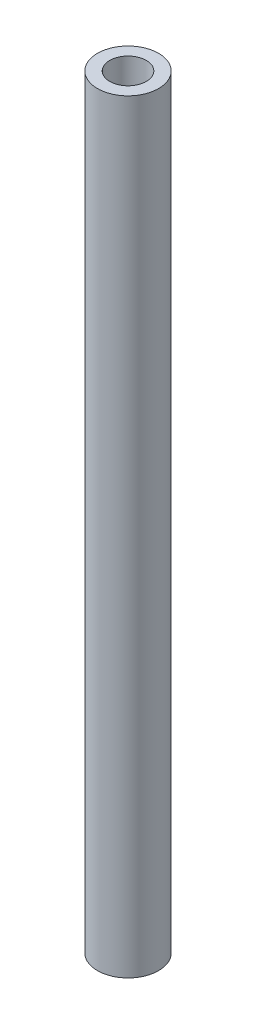
ISO-10303-21;
HEADER;
FILE_DESCRIPTION(('STEP AP214'),'2;1');
FILE_NAME('part.step','',(''),(''),'','','');
FILE_SCHEMA(('AUTOMOTIVE_DESIGN { 1 0 10303 214 1 1 1 1 }'));
ENDSEC;
DATA;
#1=APPLICATION_CONTEXT('core data for automotive mechanical design processes');
#2=APPLICATION_PROTOCOL_DEFINITION('international standard','automotive_design',2000,#1);
#3=PRODUCT_CONTEXT('',#1,'mechanical');
#4=PRODUCT('Part','Part','',(#3));
#5=PRODUCT_RELATED_PRODUCT_CATEGORY('part','',(#4));
#6=PRODUCT_DEFINITION_FORMATION('','',#4);
#7=PRODUCT_DEFINITION_CONTEXT('part definition',#1,'design');
#8=PRODUCT_DEFINITION('design','',#6,#7);
#9=PRODUCT_DEFINITION_SHAPE('','',#8);
#10=(LENGTH_UNIT() NAMED_UNIT(*) SI_UNIT(.MILLI.,.METRE.));
#11=(NAMED_UNIT(*) PLANE_ANGLE_UNIT() SI_UNIT($,.RADIAN.));
#12=(NAMED_UNIT(*) SI_UNIT($,.STERADIAN.) SOLID_ANGLE_UNIT());
#13=UNCERTAINTY_MEASURE_WITH_UNIT(LENGTH_MEASURE(1.E-05),#10,'distance_accuracy_value','');
#14=(GEOMETRIC_REPRESENTATION_CONTEXT(3) GLOBAL_UNCERTAINTY_ASSIGNED_CONTEXT((#13)) GLOBAL_UNIT_ASSIGNED_CONTEXT((#10,
#11,#12)) REPRESENTATION_CONTEXT('',''));
#15=CARTESIAN_POINT('',(0.,0.,0.));
#16=DIRECTION('',(0.,0.,1.));
#17=DIRECTION('',(1.,0.,0.));
#18=AXIS2_PLACEMENT_3D('',#15,#16,#17);
#19=CARTESIAN_POINT('',(0.,79.375,0.));
#20=DIRECTION('',(0.,-1.,0.));
#21=DIRECTION('',(0.,0.,-1.));
#22=AXIS2_PLACEMENT_3D('',#19,#20,#21);
#23=CYLINDRICAL_SURFACE('',#22,3.175);
#24=CARTESIAN_POINT('',(0.,79.375,0.));
#25=DIRECTION('',(0.,1.,0.));
#26=DIRECTION('',(0.,0.,1.));
#27=AXIS2_PLACEMENT_3D('',#24,#25,#26);
#28=CIRCLE('',#27,3.175);
#29=CARTESIAN_POINT('',(0.,79.375,-3.175));
#30=VERTEX_POINT('',#29);
#31=EDGE_CURVE('E11',#30,#30,#28,.T.);
#32=CARTESIAN_POINT('',(0.,0.,0.));
#33=DIRECTION('',(0.,1.,0.));
#34=DIRECTION('',(0.,0.,1.));
#35=AXIS2_PLACEMENT_3D('',#32,#33,#34);
#36=CIRCLE('',#35,3.175);
#37=CARTESIAN_POINT('',(0.,0.,-3.175));
#38=VERTEX_POINT('',#37);
#39=EDGE_CURVE('E46',#38,#38,#36,.T.);
#40=CARTESIAN_POINT('',(0.,79.375,-3.175));
#41=CARTESIAN_POINT('',(0.,78.5481770833333,-3.175));
#42=CARTESIAN_POINT('',(0.,77.7213541666667,-3.175));
#43=CARTESIAN_POINT('',(0.,76.0677083333333,-3.175));
#44=CARTESIAN_POINT('',(0.,75.2408854166667,-3.175));
#45=CARTESIAN_POINT('',(0.,73.5872395833333,-3.175));
#46=CARTESIAN_POINT('',(0.,72.7604166666667,-3.175));
#47=CARTESIAN_POINT('',(0.,71.1067708333333,-3.175));
#48=CARTESIAN_POINT('',(0.,70.2799479166667,-3.175));
#49=CARTESIAN_POINT('',(0.,68.6263020833333,-3.175));
#50=CARTESIAN_POINT('',(0.,67.7994791666667,-3.175));
#51=CARTESIAN_POINT('',(0.,66.1458333333333,-3.175));
#52=CARTESIAN_POINT('',(0.,65.3190104166667,-3.175));
#53=CARTESIAN_POINT('',(0.,63.6653645833333,-3.175));
#54=CARTESIAN_POINT('',(0.,62.8385416666667,-3.175));
#55=CARTESIAN_POINT('',(0.,61.1848958333333,-3.175));
#56=CARTESIAN_POINT('',(0.,60.3580729166667,-3.175));
#57=CARTESIAN_POINT('',(0.,58.7044270833333,-3.175));
#58=CARTESIAN_POINT('',(0.,57.8776041666667,-3.175));
#59=CARTESIAN_POINT('',(0.,56.2239583333333,-3.175));
#60=CARTESIAN_POINT('',(0.,55.3971354166667,-3.175));
#61=CARTESIAN_POINT('',(0.,53.7434895833333,-3.175));
#62=CARTESIAN_POINT('',(0.,52.9166666666667,-3.175));
#63=CARTESIAN_POINT('',(0.,51.2630208333333,-3.175));
#64=CARTESIAN_POINT('',(0.,50.4361979166667,-3.175));
#65=CARTESIAN_POINT('',(0.,48.7825520833333,-3.175));
#66=CARTESIAN_POINT('',(0.,47.9557291666667,-3.175));
#67=CARTESIAN_POINT('',(0.,46.3020833333333,-3.175));
#68=CARTESIAN_POINT('',(0.,45.4752604166667,-3.175));
#69=CARTESIAN_POINT('',(0.,43.8216145833333,-3.175));
#70=CARTESIAN_POINT('',(0.,42.9947916666667,-3.175));
#71=CARTESIAN_POINT('',(0.,41.3411458333333,-3.175));
#72=CARTESIAN_POINT('',(0.,40.5143229166667,-3.175));
#73=CARTESIAN_POINT('',(0.,38.8606770833333,-3.175));
#74=CARTESIAN_POINT('',(0.,38.0338541666667,-3.175));
#75=CARTESIAN_POINT('',(0.,36.3802083333333,-3.175));
#76=CARTESIAN_POINT('',(0.,35.5533854166667,-3.175));
#77=CARTESIAN_POINT('',(0.,33.8997395833333,-3.175));
#78=CARTESIAN_POINT('',(0.,33.0729166666667,-3.175));
#79=CARTESIAN_POINT('',(0.,31.4192708333333,-3.175));
#80=CARTESIAN_POINT('',(0.,30.5924479166667,-3.175));
#81=CARTESIAN_POINT('',(0.,28.9388020833333,-3.175));
#82=CARTESIAN_POINT('',(0.,28.1119791666667,-3.175));
#83=CARTESIAN_POINT('',(0.,26.4583333333333,-3.175));
#84=CARTESIAN_POINT('',(0.,25.6315104166667,-3.175));
#85=CARTESIAN_POINT('',(0.,23.9778645833333,-3.175));
#86=CARTESIAN_POINT('',(0.,23.1510416666667,-3.175));
#87=CARTESIAN_POINT('',(0.,21.4973958333333,-3.175));
#88=CARTESIAN_POINT('',(0.,20.6705729166667,-3.175));
#89=CARTESIAN_POINT('',(0.,19.0169270833333,-3.175));
#90=CARTESIAN_POINT('',(0.,18.1901041666667,-3.175));
#91=CARTESIAN_POINT('',(0.,16.5364583333333,-3.175));
#92=CARTESIAN_POINT('',(0.,15.7096354166667,-3.175));
#93=CARTESIAN_POINT('',(0.,14.0559895833333,-3.175));
#94=CARTESIAN_POINT('',(0.,13.2291666666667,-3.175));
#95=CARTESIAN_POINT('',(0.,11.5755208333333,-3.175));
#96=CARTESIAN_POINT('',(0.,10.7486979166667,-3.175));
#97=CARTESIAN_POINT('',(0.,9.09505208333332,-3.175));
#98=CARTESIAN_POINT('',(0.,8.26822916666666,-3.175));
#99=CARTESIAN_POINT('',(0.,6.61458333333332,-3.175));
#100=CARTESIAN_POINT('',(0.,5.78776041666665,-3.175));
#101=CARTESIAN_POINT('',(0.,4.13411458333332,-3.175));
#102=CARTESIAN_POINT('',(0.,3.30729166666666,-3.175));
#103=CARTESIAN_POINT('',(0.,1.65364583333332,-3.175));
#104=CARTESIAN_POINT('',(0.,0.826822916666655,-3.175));
#105=CARTESIAN_POINT('',(0.,0.,-3.175));
#106=B_SPLINE_CURVE_WITH_KNOTS('',3,(#40,#41,#42,#43,#44,#45,#46,#47,#48,#49,#50,#51,#52,#53,
#54,#55,#56,#57,#58,#59,#60,#61,#62,#63,#64,#65,#66,#67,#68,#69,#70,#71,#72,#73,#74,#75,#76,#77,
#78,#79,#80,#81,#82,#83,#84,#85,#86,#87,#88,#89,#90,#91,#92,#93,#94,#95,#96,#97,#98,#99,#100,
#101,#102,#103,#104,#105),.UNSPECIFIED.,.F.,.F.,(4,2,2,2,2,2,2,2,2,2,2,2,2,2,2,2,2,2,2,2,2,2,2,
2,2,2,2,2,2,2,2,2,4),(0.,2.48046874999999,4.9609375,7.44140624999999,9.921875,12.40234375,
14.8828125,17.36328125,19.84375,22.32421875,24.8046875,27.28515625,29.765625,32.24609375,
34.7265625,37.20703125,39.6875,42.16796875,44.6484375,47.12890625,49.609375,52.08984375,
54.5703125,57.05078125,59.53125,62.01171875,64.4921875,66.97265625,69.453125,71.93359375,
74.4140625,76.89453125,79.375),.UNSPECIFIED.);
#107=EDGE_CURVE('BSEAM43',#30,#38,#106,.T.);
#108=ORIENTED_EDGE('',*,*,#31,.F.);
#109=ORIENTED_EDGE('',*,*,#39,.T.);
#110=ORIENTED_EDGE('',*,*,#107,.T.);
#111=ORIENTED_EDGE('',*,*,#107,.F.);
#112=EDGE_LOOP('',(#108,#110,#109,#111));
#113=FACE_BOUND('',#112,.T.);
#114=ADVANCED_FACE('F43',(#113),#23,.T.);
#115=CARTESIAN_POINT('',(0.,79.375,0.));
#116=DIRECTION('',(0.,1.,0.));
#117=DIRECTION('',(0.,0.,1.));
#118=AXIS2_PLACEMENT_3D('',#115,#116,#117);
#119=PLANE('',#118);
#120=CARTESIAN_POINT('',(0.,79.375,0.));
#121=DIRECTION('',(0.,1.,0.));
#122=DIRECTION('',(0.,0.,1.));
#123=AXIS2_PLACEMENT_3D('',#120,#121,#122);
#124=CIRCLE('',#123,1.89864999999999);
#125=CARTESIAN_POINT('',(0.,79.375,1.89864999999999));
#126=VERTEX_POINT('',#125);
#127=EDGE_CURVE('E66',#126,#126,#124,.T.);
#128=ORIENTED_EDGE('',*,*,#127,.F.);
#129=EDGE_LOOP('',(#128));
#130=FACE_BOUND('',#129,.T.);
#131=ORIENTED_EDGE('',*,*,#31,.T.);
#132=EDGE_LOOP('',(#131));
#133=FACE_BOUND('',#132,.T.);
#134=ADVANCED_FACE('F85',(#130,#133),#119,.T.);
#135=CARTESIAN_POINT('',(0.,0.,0.));
#136=DIRECTION('',(0.,1.,0.));
#137=DIRECTION('',(0.,0.,1.));
#138=AXIS2_PLACEMENT_3D('',#135,#136,#137);
#139=PLANE('',#138);
#140=CARTESIAN_POINT('',(0.,0.,0.));
#141=DIRECTION('',(0.,-1.,0.));
#142=DIRECTION('',(0.,0.,-1.));
#143=AXIS2_PLACEMENT_3D('',#140,#141,#142);
#144=CIRCLE('',#143,1.89864999999999);
#145=CARTESIAN_POINT('',(0.,0.,-1.89864999999999));
#146=VERTEX_POINT('',#145);
#147=EDGE_CURVE('E67',#146,#146,#144,.T.);
#148=ORIENTED_EDGE('',*,*,#147,.F.);
#149=EDGE_LOOP('',(#148));
#150=FACE_BOUND('',#149,.T.);
#151=ORIENTED_EDGE('',*,*,#39,.F.);
#152=EDGE_LOOP('',(#151));
#153=FACE_BOUND('',#152,.T.);
#154=ADVANCED_FACE('F82',(#150,#153),#139,.F.);
#155=CARTESIAN_POINT('',(0.,66.675,0.));
#156=DIRECTION('',(0.,1.,0.));
#157=DIRECTION('',(0.,0.,1.));
#158=AXIS2_PLACEMENT_3D('',#155,#156,#157);
#159=CONICAL_SURFACE('',#158,1.89865,1.02974425867666);
#160=CARTESIAN_POINT('',(0.,65.5341759856833,0.));
#161=VERTEX_POINT('',#160);
#162=VERTEX_LOOP('',#161);
#163=FACE_BOUND('',#162,.T.);
#164=CARTESIAN_POINT('',(0.,66.675,0.));
#165=DIRECTION('',(0.,1.,0.));
#166=DIRECTION('',(0.,0.,1.));
#167=AXIS2_PLACEMENT_3D('',#164,#165,#166);
#168=CIRCLE('',#167,1.89865);
#169=CARTESIAN_POINT('',(0.,66.675,1.89865));
#170=VERTEX_POINT('',#169);
#171=EDGE_CURVE('E70',#170,#170,#168,.T.);
#172=ORIENTED_EDGE('',*,*,#171,.T.);
#173=EDGE_LOOP('',(#172));
#174=FACE_BOUND('',#173,.T.);
#175=ADVANCED_FACE('F84',(#163,#174),#159,.F.);
#176=CARTESIAN_POINT('',(0.,79.375,0.));
#177=DIRECTION('',(0.,1.,0.));
#178=DIRECTION('',(0.,0.,1.));
#179=AXIS2_PLACEMENT_3D('',#176,#177,#178);
#180=CYLINDRICAL_SURFACE('',#179,1.89864999999999);
#181=ORIENTED_EDGE('',*,*,#171,.F.);
#182=EDGE_LOOP('',(#181));
#183=FACE_BOUND('',#182,.T.);
#184=ORIENTED_EDGE('',*,*,#127,.T.);
#185=EDGE_LOOP('',(#184));
#186=FACE_BOUND('',#185,.T.);
#187=ADVANCED_FACE('F60',(#183,#186),#180,.F.);
#188=CARTESIAN_POINT('',(0.,12.7,0.));
#189=DIRECTION('',(0.,-1.,0.));
#190=DIRECTION('',(0.,0.,-1.));
#191=AXIS2_PLACEMENT_3D('',#188,#189,#190);
#192=CONICAL_SURFACE('',#191,1.89865,1.02974425867665);
#193=CARTESIAN_POINT('',(0.,13.8408240143167,0.));
#194=VERTEX_POINT('',#193);
#195=VERTEX_LOOP('',#194);
#196=FACE_BOUND('',#195,.T.);
#197=CARTESIAN_POINT('',(0.,12.7,0.));
#198=DIRECTION('',(0.,-1.,0.));
#199=DIRECTION('',(0.,0.,-1.));
#200=AXIS2_PLACEMENT_3D('',#197,#198,#199);
#201=CIRCLE('',#200,1.89865);
#202=CARTESIAN_POINT('',(0.,12.7,-1.89865));
#203=VERTEX_POINT('',#202);
#204=EDGE_CURVE('E64',#203,#203,#201,.T.);
#205=ORIENTED_EDGE('',*,*,#204,.T.);
#206=EDGE_LOOP('',(#205));
#207=FACE_BOUND('',#206,.T.);
#208=ADVANCED_FACE('F56',(#196,#207),#192,.F.);
#209=CARTESIAN_POINT('',(0.,0.,0.));
#210=DIRECTION('',(0.,-1.,0.));
#211=DIRECTION('',(0.,0.,-1.));
#212=AXIS2_PLACEMENT_3D('',#209,#210,#211);
#213=CYLINDRICAL_SURFACE('',#212,1.89864999999999);
#214=ORIENTED_EDGE('',*,*,#204,.F.);
#215=EDGE_LOOP('',(#214));
#216=FACE_BOUND('',#215,.T.);
#217=ORIENTED_EDGE('',*,*,#147,.T.);
#218=EDGE_LOOP('',(#217));
#219=FACE_BOUND('',#218,.T.);
#220=ADVANCED_FACE('F59',(#216,#219),#213,.F.);
#221=CLOSED_SHELL('',(#114,#134,#154,#175,#187,#208,#220));
#222=MANIFOLD_SOLID_BREP('B2',#221);
#223=ADVANCED_BREP_SHAPE_REPRESENTATION('',(#18,#222),#14);
#224=SHAPE_DEFINITION_REPRESENTATION(#9,#223);
ENDSEC;
END-ISO-10303-21;
